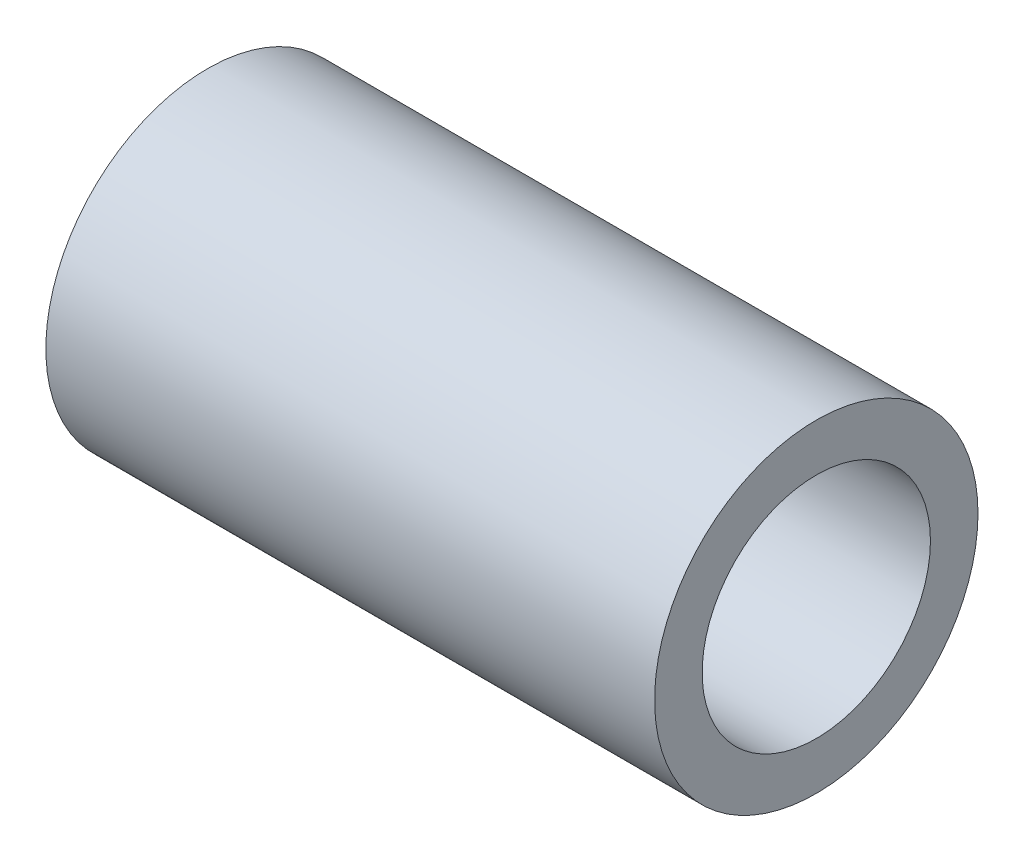
ISO-10303-21;
HEADER;
FILE_DESCRIPTION(('STEP AP214'),'2;1');
FILE_NAME('part.step','',(''),(''),'','','');
FILE_SCHEMA(('AUTOMOTIVE_DESIGN { 1 0 10303 214 1 1 1 1 }'));
ENDSEC;
DATA;
#1=APPLICATION_CONTEXT('core data for automotive mechanical design processes');
#2=APPLICATION_PROTOCOL_DEFINITION('international standard','automotive_design',2000,#1);
#3=PRODUCT_CONTEXT('',#1,'mechanical');
#4=PRODUCT('Part','Part','',(#3));
#5=PRODUCT_RELATED_PRODUCT_CATEGORY('part','',(#4));
#6=PRODUCT_DEFINITION_FORMATION('','',#4);
#7=PRODUCT_DEFINITION_CONTEXT('part definition',#1,'design');
#8=PRODUCT_DEFINITION('design','',#6,#7);
#9=PRODUCT_DEFINITION_SHAPE('','',#8);
#10=(LENGTH_UNIT() NAMED_UNIT(*) SI_UNIT(.MILLI.,.METRE.));
#11=(NAMED_UNIT(*) PLANE_ANGLE_UNIT() SI_UNIT($,.RADIAN.));
#12=(NAMED_UNIT(*) SI_UNIT($,.STERADIAN.) SOLID_ANGLE_UNIT());
#13=UNCERTAINTY_MEASURE_WITH_UNIT(LENGTH_MEASURE(1.E-05),#10,'distance_accuracy_value','');
#14=(GEOMETRIC_REPRESENTATION_CONTEXT(3) GLOBAL_UNCERTAINTY_ASSIGNED_CONTEXT((#13)) GLOBAL_UNIT_ASSIGNED_CONTEXT((#10,
#11,#12)) REPRESENTATION_CONTEXT('',''));
#15=CARTESIAN_POINT('',(0.,0.,0.));
#16=DIRECTION('',(0.,0.,1.));
#17=DIRECTION('',(1.,0.,0.));
#18=AXIS2_PLACEMENT_3D('',#15,#16,#17);
#19=CARTESIAN_POINT('',(0.,0.,0.));
#20=DIRECTION('',(1.,0.,0.));
#21=DIRECTION('',(0.,0.,-1.));
#22=AXIS2_PLACEMENT_3D('',#19,#20,#21);
#23=PLANE('',#22);
#24=CARTESIAN_POINT('',(0.,0.,0.));
#25=DIRECTION('',(1.,0.,0.));
#26=DIRECTION('',(0.,0.,-1.));
#27=AXIS2_PLACEMENT_3D('',#24,#25,#26);
#28=CIRCLE('',#27,9.525);
#29=CARTESIAN_POINT('',(0.,0.,-9.525));
#30=VERTEX_POINT('',#29);
#31=EDGE_CURVE('E66',#30,#30,#28,.F.);
#32=ORIENTED_EDGE('',*,*,#31,.F.);
#33=EDGE_LOOP('',(#32));
#34=FACE_BOUND('',#33,.T.);
#35=CARTESIAN_POINT('',(0.,0.,0.));
#36=DIRECTION('',(1.,0.,0.));
#37=DIRECTION('',(0.,0.,-1.));
#38=AXIS2_PLACEMENT_3D('',#35,#36,#37);
#39=CIRCLE('',#38,13.49375);
#40=CARTESIAN_POINT('',(0.,0.,-13.49375));
#41=VERTEX_POINT('',#40);
#42=EDGE_CURVE('E56',#41,#41,#39,.T.);
#43=ORIENTED_EDGE('',*,*,#42,.F.);
#44=EDGE_LOOP('',(#43));
#45=FACE_BOUND('',#44,.T.);
#46=ADVANCED_FACE('F49',(#34,#45),#23,.F.);
#47=CARTESIAN_POINT('',(50.8,0.,0.));
#48=DIRECTION('',(1.,0.,0.));
#49=DIRECTION('',(0.,0.,-1.));
#50=AXIS2_PLACEMENT_3D('',#47,#48,#49);
#51=PLANE('',#50);
#52=CARTESIAN_POINT('',(50.8,0.,0.));
#53=DIRECTION('',(1.,0.,0.));
#54=DIRECTION('',(0.,0.,-1.));
#55=AXIS2_PLACEMENT_3D('',#52,#53,#54);
#56=CIRCLE('',#55,9.525);
#57=CARTESIAN_POINT('',(50.8,0.,-9.525));
#58=VERTEX_POINT('',#57);
#59=EDGE_CURVE('E61',#58,#58,#56,.F.);
#60=ORIENTED_EDGE('',*,*,#59,.T.);
#61=EDGE_LOOP('',(#60));
#62=FACE_BOUND('',#61,.T.);
#63=CARTESIAN_POINT('',(50.8,0.,0.));
#64=DIRECTION('',(1.,0.,0.));
#65=DIRECTION('',(0.,0.,-1.));
#66=AXIS2_PLACEMENT_3D('',#63,#64,#65);
#67=CIRCLE('',#66,13.49375);
#68=CARTESIAN_POINT('',(50.8,0.,-13.49375));
#69=VERTEX_POINT('',#68);
#70=EDGE_CURVE('E11',#69,#69,#67,.T.);
#71=ORIENTED_EDGE('',*,*,#70,.T.);
#72=EDGE_LOOP('',(#71));
#73=FACE_BOUND('',#72,.T.);
#74=ADVANCED_FACE('F78',(#62,#73),#51,.T.);
#75=CARTESIAN_POINT('',(0.,0.,0.));
#76=DIRECTION('',(1.,0.,0.));
#77=DIRECTION('',(0.,0.,-1.));
#78=AXIS2_PLACEMENT_3D('',#75,#76,#77);
#79=CYLINDRICAL_SURFACE('',#78,13.49375);
#80=ORIENTED_EDGE('',*,*,#70,.F.);
#81=EDGE_LOOP('',(#80));
#82=FACE_BOUND('',#81,.T.);
#83=ORIENTED_EDGE('',*,*,#42,.T.);
#84=EDGE_LOOP('',(#83));
#85=FACE_BOUND('',#84,.T.);
#86=ADVANCED_FACE('F82',(#82,#85),#79,.T.);
#87=CARTESIAN_POINT('',(-4.,0.,0.));
#88=DIRECTION('',(1.,0.,0.));
#89=DIRECTION('',(0.,0.,-1.));
#90=AXIS2_PLACEMENT_3D('',#87,#88,#89);
#91=CYLINDRICAL_SURFACE('',#90,9.525);
#92=ORIENTED_EDGE('',*,*,#31,.T.);
#93=EDGE_LOOP('',(#92));
#94=FACE_BOUND('',#93,.T.);
#95=ORIENTED_EDGE('',*,*,#59,.F.);
#96=EDGE_LOOP('',(#95));
#97=FACE_BOUND('',#96,.T.);
#98=ADVANCED_FACE('F73',(#94,#97),#91,.F.);
#99=CLOSED_SHELL('',(#46,#74,#86,#98));
#100=MANIFOLD_SOLID_BREP('B2',#99);
#101=ADVANCED_BREP_SHAPE_REPRESENTATION('',(#18,#100),#14);
#102=SHAPE_DEFINITION_REPRESENTATION(#9,#101);
ENDSEC;
END-ISO-10303-21;
